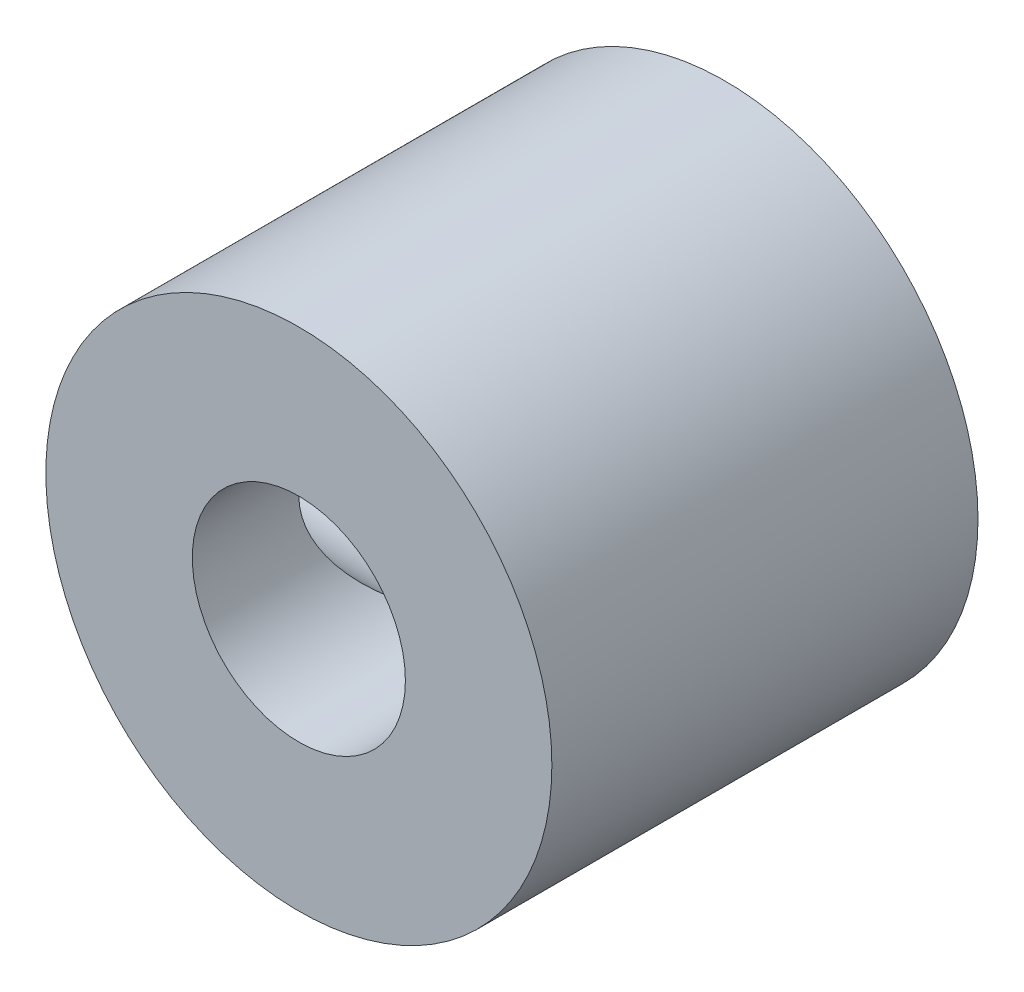
ISO-10303-21;
HEADER;
FILE_DESCRIPTION(('STEP AP214'),'2;1');
FILE_NAME('part.step','',(''),(''),'','','');
FILE_SCHEMA(('AUTOMOTIVE_DESIGN { 1 0 10303 214 1 1 1 1 }'));
ENDSEC;
DATA;
#1=APPLICATION_CONTEXT('core data for automotive mechanical design processes');
#2=APPLICATION_PROTOCOL_DEFINITION('international standard','automotive_design',2000,#1);
#3=PRODUCT_CONTEXT('',#1,'mechanical');
#4=PRODUCT('Part','Part','',(#3));
#5=PRODUCT_RELATED_PRODUCT_CATEGORY('part','',(#4));
#6=PRODUCT_DEFINITION_FORMATION('','',#4);
#7=PRODUCT_DEFINITION_CONTEXT('part definition',#1,'design');
#8=PRODUCT_DEFINITION('design','',#6,#7);
#9=PRODUCT_DEFINITION_SHAPE('','',#8);
#10=(LENGTH_UNIT() NAMED_UNIT(*) SI_UNIT(.MILLI.,.METRE.));
#11=(NAMED_UNIT(*) PLANE_ANGLE_UNIT() SI_UNIT($,.RADIAN.));
#12=(NAMED_UNIT(*) SI_UNIT($,.STERADIAN.) SOLID_ANGLE_UNIT());
#13=UNCERTAINTY_MEASURE_WITH_UNIT(LENGTH_MEASURE(1.E-05),#10,'distance_accuracy_value','');
#14=(GEOMETRIC_REPRESENTATION_CONTEXT(3) GLOBAL_UNCERTAINTY_ASSIGNED_CONTEXT((#13)) GLOBAL_UNIT_ASSIGNED_CONTEXT((#10,
#11,#12)) REPRESENTATION_CONTEXT('',''));
#15=CARTESIAN_POINT('',(0.,0.,0.));
#16=DIRECTION('',(0.,0.,1.));
#17=DIRECTION('',(1.,0.,0.));
#18=AXIS2_PLACEMENT_3D('',#15,#16,#17);
#19=CARTESIAN_POINT('',(0.,0.,8.));
#20=DIRECTION('',(0.,0.,1.));
#21=DIRECTION('',(1.,0.,0.));
#22=AXIS2_PLACEMENT_3D('',#19,#20,#21);
#23=PLANE('',#22);
#24=CARTESIAN_POINT('',(0.,0.,8.));
#25=DIRECTION('',(0.,0.,1.));
#26=DIRECTION('',(1.,0.,0.));
#27=AXIS2_PLACEMENT_3D('',#24,#25,#26);
#28=CIRCLE('',#27,4.75);
#29=CARTESIAN_POINT('',(4.75,0.,8.));
#30=VERTEX_POINT('',#29);
#31=EDGE_CURVE('E53',#30,#30,#28,.T.);
#32=ORIENTED_EDGE('',*,*,#31,.T.);
#33=EDGE_LOOP('',(#32));
#34=FACE_BOUND('',#33,.T.);
#35=CARTESIAN_POINT('',(0.,0.,8.));
#36=DIRECTION('',(0.,0.,1.));
#37=DIRECTION('',(1.,0.,0.));
#38=AXIS2_PLACEMENT_3D('',#35,#36,#37);
#39=CIRCLE('',#38,2.);
#40=CARTESIAN_POINT('',(2.,0.,8.));
#41=VERTEX_POINT('',#40);
#42=EDGE_CURVE('E61',#41,#41,#39,.T.);
#43=ORIENTED_EDGE('',*,*,#42,.F.);
#44=EDGE_LOOP('',(#43));
#45=FACE_BOUND('',#44,.T.);
#46=ADVANCED_FACE('F35',(#34,#45),#23,.T.);
#47=CARTESIAN_POINT('',(0.,0.,0.));
#48=DIRECTION('',(0.,0.,1.));
#49=DIRECTION('',(1.,0.,0.));
#50=AXIS2_PLACEMENT_3D('',#47,#48,#49);
#51=PLANE('',#50);
#52=CARTESIAN_POINT('',(0.,0.,0.));
#53=DIRECTION('',(0.,0.,1.));
#54=DIRECTION('',(1.,0.,0.));
#55=AXIS2_PLACEMENT_3D('',#52,#53,#54);
#56=CIRCLE('',#55,4.75);
#57=CARTESIAN_POINT('',(4.75,0.,0.));
#58=VERTEX_POINT('',#57);
#59=EDGE_CURVE('E68',#58,#58,#56,.T.);
#60=ORIENTED_EDGE('',*,*,#59,.F.);
#61=EDGE_LOOP('',(#60));
#62=FACE_BOUND('',#61,.T.);
#63=CARTESIAN_POINT('',(0.,0.,0.));
#64=DIRECTION('',(0.,0.,1.));
#65=DIRECTION('',(1.,0.,0.));
#66=AXIS2_PLACEMENT_3D('',#63,#64,#65);
#67=CIRCLE('',#66,2.);
#68=CARTESIAN_POINT('',(2.,0.,0.));
#69=VERTEX_POINT('',#68);
#70=EDGE_CURVE('E64',#69,#69,#67,.T.);
#71=ORIENTED_EDGE('',*,*,#70,.T.);
#72=EDGE_LOOP('',(#71));
#73=FACE_BOUND('',#72,.T.);
#74=ADVANCED_FACE('F79',(#62,#73),#51,.F.);
#75=CARTESIAN_POINT('',(0.,0.,8.));
#76=DIRECTION('',(0.,0.,-1.));
#77=DIRECTION('',(-1.,0.,0.));
#78=AXIS2_PLACEMENT_3D('',#75,#76,#77);
#79=CYLINDRICAL_SURFACE('',#78,4.75);
#80=CARTESIAN_POINT('',(-4.75,0.,2.));
#81=CARTESIAN_POINT('',(-4.74999105230106,0.107036462368458,2.00001185467003));
#82=CARTESIAN_POINT('',(-4.7463402994097,0.21423624616739,2.00864341046847));
#83=CARTESIAN_POINT('',(-4.73208882609393,0.425593131869901,2.04286084892646));
#84=CARTESIAN_POINT('',(-4.7214701827862,0.52974166164922,2.06849045598295));
#85=CARTESIAN_POINT('',(-4.69442284735135,0.731590406184853,2.13558520544629));
#86=CARTESIAN_POINT('',(-4.67801402078023,0.829311330167874,2.17699624167746));
#87=CARTESIAN_POINT('',(-4.64097919078582,1.01632284675021,2.27425264287692));
#88=CARTESIAN_POINT('',(-4.62035441557184,1.10561588355067,2.33009380524417));
#89=CARTESIAN_POINT('',(-4.57576887526126,1.27793883653739,2.45763430072049));
#90=CARTESIAN_POINT('',(-4.55169736788395,1.36048223127562,2.5299519132003));
#91=CARTESIAN_POINT('',(-4.50340541179333,1.51268912853782,2.68708449633));
#92=CARTESIAN_POINT('',(-4.4791848902796,1.58234571599153,2.77190613303968));
#93=CARTESIAN_POINT('',(-4.43196710928289,1.71027969557346,2.95682816373201));
#94=CARTESIAN_POINT('',(-4.40909335958272,1.76780496391063,3.05748375759631));
#95=CARTESIAN_POINT('',(-4.36892020968374,1.86489069620242,3.26814404396651));
#96=CARTESIAN_POINT('',(-4.35161787932547,1.90446060785823,3.37814378353564));
#97=CARTESIAN_POINT('',(-4.32574780180008,1.9624924807831,3.59876926492375));
#98=CARTESIAN_POINT('',(-4.31679434717452,1.98189190257055,3.70910142765978));
#99=CARTESIAN_POINT('',(-4.30752932662971,2.00195562895775,3.93179014382348));
#100=CARTESIAN_POINT('',(-4.30721284881606,2.00263058226539,4.0441455102597));
#101=CARTESIAN_POINT('',(-4.31493181644961,1.98593120072107,4.25826087329413));
#102=CARTESIAN_POINT('',(-4.32231278335098,1.96997131078922,4.36015956235388));
#103=CARTESIAN_POINT('',(-4.34348696653289,1.92283162811082,4.55966937858663));
#104=CARTESIAN_POINT('',(-4.35728144163054,1.89164884741754,4.65727965993019));
#105=CARTESIAN_POINT('',(-4.39004171904363,1.81433790634178,4.84793368479396));
#106=CARTESIAN_POINT('',(-4.40911227810592,1.76790298398402,4.94083422365563));
#107=CARTESIAN_POINT('',(-4.45025281005121,1.66162325591989,5.11789105597806));
#108=CARTESIAN_POINT('',(-4.47232397828682,1.60177309979156,5.20204384090033));
#109=CARTESIAN_POINT('',(-4.51930009875198,1.46428805277278,5.36687568768908));
#110=CARTESIAN_POINT('',(-4.54428505688557,1.38556278942612,5.44662508919411));
#111=CARTESIAN_POINT('',(-4.59266646060081,1.21561328405725,5.59210540818833));
#112=CARTESIAN_POINT('',(-4.61606251734623,1.12438599890452,5.65783290260047));
#113=CARTESIAN_POINT('',(-4.65933566537717,0.929145948219353,5.77480652006991));
#114=CARTESIAN_POINT('',(-4.67911472030857,0.824878687890046,5.8256668320559));
#115=CARTESIAN_POINT('',(-4.7121696275971,0.608222262411322,5.90879721077322));
#116=CARTESIAN_POINT('',(-4.72544915152312,0.495837723966098,5.94107777497581));
#117=CARTESIAN_POINT('',(-4.7433183819797,0.273899430083201,5.98416879986865));
#118=CARTESIAN_POINT('',(-4.74841197266554,0.164628362907148,5.99622640629035));
#119=CARTESIAN_POINT('',(-4.7509495140171,-0.0544859422097764,6.00225688770033));
#120=CARTESIAN_POINT('',(-4.74839572034202,-0.164329001896027,5.99623509535526));
#121=CARTESIAN_POINT('',(-4.73625128095379,-0.375578198064442,5.96716371513056));
#122=CARTESIAN_POINT('',(-4.72702550402367,-0.477129162603387,5.94499662860025));
#123=CARTESIAN_POINT('',(-4.70285789767311,-0.674955484098694,5.88549954918653));
#124=CARTESIAN_POINT('',(-4.68791534993974,-0.771230176352195,5.84816765080633));
#125=CARTESIAN_POINT('',(-4.65316408364171,-0.959158229909816,5.75818319107785));
#126=CARTESIAN_POINT('',(-4.63321831478799,-1.05057430517146,5.70508972020642));
#127=CARTESIAN_POINT('',(-4.59058023824968,-1.22352777344185,5.58557278820671));
#128=CARTESIAN_POINT('',(-4.56788677524527,-1.30506098197807,5.51914371209315));
#129=CARTESIAN_POINT('',(-4.52014832220439,-1.46218525430955,5.36917868494244));
#130=CARTESIAN_POINT('',(-4.49505251450344,-1.53690971771379,5.28474862531491));
#131=CARTESIAN_POINT('',(-4.44680874465642,-1.67137911518237,5.10415965374133));
#132=CARTESIAN_POINT('',(-4.42366126112371,-1.73112037565902,5.00799787398111));
#133=CARTESIAN_POINT('',(-4.38175075287145,-1.83465029067007,4.80453691910517));
#134=CARTESIAN_POINT('',(-4.3630615717636,-1.87817619877721,4.69708770089127));
#135=CARTESIAN_POINT('',(-4.33317944385815,-1.94613970779112,4.4753490302796));
#136=CARTESIAN_POINT('',(-4.32198014009814,-1.97059349891389,4.36106546845803));
#137=CARTESIAN_POINT('',(-4.30933055153168,-1.99809365532078,4.13853907201371));
#138=CARTESIAN_POINT('',(-4.30718588214918,-2.00266563478006,4.03052346088461));
#139=CARTESIAN_POINT('',(-4.31103684419065,-1.99436289136938,3.81532413753089));
#140=CARTESIAN_POINT('',(-4.31703116084065,-1.98149098638983,3.70814029375512));
#141=CARTESIAN_POINT('',(-4.33584430782861,-1.93995635081153,3.5030146088952));
#142=CARTESIAN_POINT('',(-4.34831777145251,-1.91209039204409,3.40487669732396));
#143=CARTESIAN_POINT('',(-4.37840569203651,-1.84214689268935,3.21465149430263));
#144=CARTESIAN_POINT('',(-4.39602159966499,-1.80006534139776,3.12256591919172));
#145=CARTESIAN_POINT('',(-4.43573763071445,-1.69994007024286,2.94094245587041));
#146=CARTESIAN_POINT('',(-4.45804534068644,-1.64108110570075,2.85190026114613));
#147=CARTESIAN_POINT('',(-4.5040651794814,-1.51020038304186,2.68447943852002));
#148=CARTESIAN_POINT('',(-4.52777780960673,-1.43817390715273,2.60610465024526));
#149=CARTESIAN_POINT('',(-4.57607254723289,-1.27659022248804,2.45618901611429));
#150=CARTESIAN_POINT('',(-4.60058638516999,-1.18612311549111,2.38560224377989));
#151=CARTESIAN_POINT('',(-4.64594055900097,-0.993725379452199,2.26055510456004));
#152=CARTESIAN_POINT('',(-4.66677922394583,-0.891789570387903,2.20610206540375));
#153=CARTESIAN_POINT('',(-4.70215008458215,-0.680840837781726,2.11601311396725));
#154=CARTESIAN_POINT('',(-4.71677703656465,-0.571965756964759,2.08009252744934));
#155=CARTESIAN_POINT('',(-4.73846042696525,-0.349166725075993,2.02741272470871));
#156=CARTESIAN_POINT('',(-4.74554047417122,-0.235259686811358,2.01059374255665));
#157=CARTESIAN_POINT('',(-4.74949001252044,-0.0806138559737815,2.00121410099845));
#158=CARTESIAN_POINT('',(-4.75000337042091,-0.0403185146594548,1.99999553458067));
#159=CARTESIAN_POINT('',(-4.75,0.,2.));
#160=B_SPLINE_CURVE_WITH_KNOTS('',3,(#80,#81,#82,#83,#84,#85,#86,#87,#88,#89,#90,#91,#92,#93,
#94,#95,#96,#97,#98,#99,#100,#101,#102,#103,#104,#105,#106,#107,#108,#109,#110,#111,#112,#113,
#114,#115,#116,#117,#118,#119,#120,#121,#122,#123,#124,#125,#126,#127,#128,#129,#130,#131,#132,
#133,#134,#135,#136,#137,#138,#139,#140,#141,#142,#143,#144,#145,#146,#147,#148,#149,#150,#151,
#152,#153,#154,#155,#156,#157,#158,#159),.UNSPECIFIED.,.T.,.F.,(4,2,2,2,2,2,2,2,2,2,2,2,2,2,2,2,
2,2,2,2,2,2,2,2,2,2,2,2,2,2,2,2,2,2,2,2,2,2,2,4),(0.,0.320992833427258,0.642814581763423,
0.963542757751976,1.2841776305755,1.61977067727506,1.95554328441994,2.30826935782324,
2.66080961894182,2.99611267136669,3.33122503119564,3.63999866694788,3.94883293312584,
4.26430374352242,4.57990059829875,4.92278837411684,5.26575976135261,5.61697022291763,
5.96798205692135,6.29642217319481,6.62476542288597,6.93639255342285,7.24805885281148,
7.56943103565565,7.89093881783371,8.23588662956778,8.58091893324744,8.93132109614982,
9.28142547982678,9.60412990992076,9.92678221645596,10.2337737894146,10.5408520476219,
10.8666093059307,11.1924835089913,11.5428100141678,11.8932953899746,12.2382234684013,
12.5820693217041,12.7029809622212),.UNSPECIFIED.);
#161=CARTESIAN_POINT('',(-4.75,0.,2.));
#162=VERTEX_POINT('',#161);
#163=EDGE_CURVE('E66',#162,#162,#160,.T.);
#164=ORIENTED_EDGE('',*,*,#163,.T.);
#165=EDGE_LOOP('',(#164));
#166=FACE_BOUND('',#165,.T.);
#167=ORIENTED_EDGE('',*,*,#31,.F.);
#168=EDGE_LOOP('',(#167));
#169=FACE_BOUND('',#168,.T.);
#170=ORIENTED_EDGE('',*,*,#59,.T.);
#171=EDGE_LOOP('',(#170));
#172=FACE_BOUND('',#171,.T.);
#173=ADVANCED_FACE('F37',(#166,#169,#172),#79,.T.);
#174=CARTESIAN_POINT('',(0.,0.,8.));
#175=DIRECTION('',(0.,0.,-1.));
#176=DIRECTION('',(-1.,0.,0.));
#177=AXIS2_PLACEMENT_3D('',#174,#175,#176);
#178=CYLINDRICAL_SURFACE('',#177,2.);
#179=CARTESIAN_POINT('',(0.,0.,4.));
#180=DIRECTION('',(0.707106781186547,0.,-0.707106781186547));
#181=DIRECTION('',(-0.707106781186547,0.,-0.707106781186547));
#182=AXIS2_PLACEMENT_3D('',#179,#180,#181);
#183=ELLIPSE('',#182,2.82842712474619,2.);
#184=CARTESIAN_POINT('',(0.,-2.,4.));
#185=VERTEX_POINT('',#184);
#186=CARTESIAN_POINT('',(0.,2.,4.));
#187=VERTEX_POINT('',#186);
#188=EDGE_CURVE('E11',#185,#187,#183,.T.);
#189=ORIENTED_EDGE('',*,*,#188,.F.);
#190=CARTESIAN_POINT('',(0.,0.,4.));
#191=DIRECTION('',(-0.707106781186547,0.,-0.707106781186547));
#192=DIRECTION('',(0.707106781186547,0.,-0.707106781186547));
#193=AXIS2_PLACEMENT_3D('',#190,#191,#192);
#194=ELLIPSE('',#193,2.82842712474619,2.);
#195=EDGE_CURVE('E44',#187,#185,#194,.F.);
#196=ORIENTED_EDGE('',*,*,#195,.F.);
#197=EDGE_LOOP('',(#189,#196));
#198=FACE_BOUND('',#197,.T.);
#199=ORIENTED_EDGE('',*,*,#42,.T.);
#200=EDGE_LOOP('',(#199));
#201=FACE_BOUND('',#200,.T.);
#202=ORIENTED_EDGE('',*,*,#70,.F.);
#203=EDGE_LOOP('',(#202));
#204=FACE_BOUND('',#203,.T.);
#205=ADVANCED_FACE('F54',(#198,#201,#204),#178,.F.);
#206=CARTESIAN_POINT('',(-4.75,0.,4.));
#207=DIRECTION('',(1.,0.,0.));
#208=DIRECTION('',(0.,0.,-1.));
#209=AXIS2_PLACEMENT_3D('',#206,#207,#208);
#210=CYLINDRICAL_SURFACE('',#209,2.);
#211=ORIENTED_EDGE('',*,*,#188,.T.);
#212=ORIENTED_EDGE('',*,*,#195,.T.);
#213=EDGE_LOOP('',(#211,#212));
#214=FACE_BOUND('',#213,.T.);
#215=ORIENTED_EDGE('',*,*,#163,.F.);
#216=EDGE_LOOP('',(#215));
#217=FACE_BOUND('',#216,.T.);
#218=ADVANCED_FACE('F50',(#214,#217),#210,.F.);
#219=CLOSED_SHELL('',(#46,#74,#173,#205,#218));
#220=MANIFOLD_SOLID_BREP('B2',#219);
#221=ADVANCED_BREP_SHAPE_REPRESENTATION('',(#18,#220),#14);
#222=SHAPE_DEFINITION_REPRESENTATION(#9,#221);
ENDSEC;
END-ISO-10303-21;
